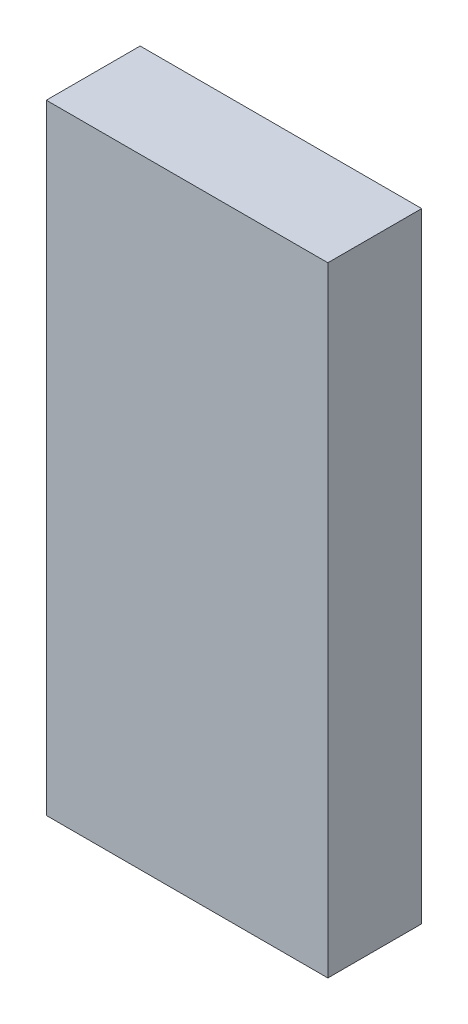
ISO-10303-21;
HEADER;
FILE_DESCRIPTION(('STEP AP214'),'2;1');
FILE_NAME('part.step','',(''),(''),'','','');
FILE_SCHEMA(('AUTOMOTIVE_DESIGN { 1 0 10303 214 1 1 1 1 }'));
ENDSEC;
DATA;
#1=APPLICATION_CONTEXT('core data for automotive mechanical design processes');
#2=APPLICATION_PROTOCOL_DEFINITION('international standard','automotive_design',2000,#1);
#3=PRODUCT_CONTEXT('',#1,'mechanical');
#4=PRODUCT('Part','Part','',(#3));
#5=PRODUCT_RELATED_PRODUCT_CATEGORY('part','',(#4));
#6=PRODUCT_DEFINITION_FORMATION('','',#4);
#7=PRODUCT_DEFINITION_CONTEXT('part definition',#1,'design');
#8=PRODUCT_DEFINITION('design','',#6,#7);
#9=PRODUCT_DEFINITION_SHAPE('','',#8);
#10=(LENGTH_UNIT() NAMED_UNIT(*) SI_UNIT(.MILLI.,.METRE.));
#11=(NAMED_UNIT(*) PLANE_ANGLE_UNIT() SI_UNIT($,.RADIAN.));
#12=(NAMED_UNIT(*) SI_UNIT($,.STERADIAN.) SOLID_ANGLE_UNIT());
#13=UNCERTAINTY_MEASURE_WITH_UNIT(LENGTH_MEASURE(1.E-05),#10,'distance_accuracy_value','');
#14=(GEOMETRIC_REPRESENTATION_CONTEXT(3) GLOBAL_UNCERTAINTY_ASSIGNED_CONTEXT((#13)) GLOBAL_UNIT_ASSIGNED_CONTEXT((#10,
#11,#12)) REPRESENTATION_CONTEXT('',''));
#15=CARTESIAN_POINT('',(0.,0.,0.));
#16=DIRECTION('',(0.,0.,1.));
#17=DIRECTION('',(1.,0.,0.));
#18=AXIS2_PLACEMENT_3D('',#15,#16,#17);
#19=CARTESIAN_POINT('',(0.,0.,5.));
#20=DIRECTION('',(1.,0.,0.));
#21=DIRECTION('',(0.,0.,-1.));
#22=AXIS2_PLACEMENT_3D('',#19,#20,#21);
#23=PLANE('',#22);
#24=DIRECTION('',(0.,-1.,0.));
#25=VECTOR('',#24,1.);
#26=CARTESIAN_POINT('',(0.,0.,0.));
#27=LINE('',#26,#25);
#28=CARTESIAN_POINT('',(0.,33.,0.));
#29=VERTEX_POINT('',#28);
#30=CARTESIAN_POINT('',(0.,0.,0.));
#31=VERTEX_POINT('',#30);
#32=EDGE_CURVE('E97',#29,#31,#27,.T.);
#33=ORIENTED_EDGE('',*,*,#32,.T.);
#34=DIRECTION('',(0.,0.,-1.));
#35=VECTOR('',#34,1.);
#36=CARTESIAN_POINT('',(0.,0.,5.));
#37=LINE('',#36,#35);
#38=CARTESIAN_POINT('',(0.,0.,5.));
#39=VERTEX_POINT('',#38);
#40=EDGE_CURVE('E11',#39,#31,#37,.T.);
#41=ORIENTED_EDGE('',*,*,#40,.F.);
#42=DIRECTION('',(0.,-1.,0.));
#43=VECTOR('',#42,1.);
#44=CARTESIAN_POINT('',(0.,0.,5.));
#45=LINE('',#44,#43);
#46=CARTESIAN_POINT('',(0.,33.,5.));
#47=VERTEX_POINT('',#46);
#48=EDGE_CURVE('E85',#47,#39,#45,.T.);
#49=ORIENTED_EDGE('',*,*,#48,.F.);
#50=DIRECTION('',(0.,0.,-1.));
#51=VECTOR('',#50,1.);
#52=CARTESIAN_POINT('',(0.,33.,5.));
#53=LINE('',#52,#51);
#54=EDGE_CURVE('E93',#47,#29,#53,.T.);
#55=ORIENTED_EDGE('',*,*,#54,.T.);
#56=EDGE_LOOP('',(#33,#41,#49,#55));
#57=FACE_BOUND('',#56,.T.);
#58=ADVANCED_FACE('F34',(#57),#23,.F.);
#59=CARTESIAN_POINT('',(0.,0.,5.));
#60=DIRECTION('',(0.,1.,0.));
#61=DIRECTION('',(0.,0.,1.));
#62=AXIS2_PLACEMENT_3D('',#59,#60,#61);
#63=PLANE('',#62);
#64=DIRECTION('',(1.,0.,0.));
#65=VECTOR('',#64,1.);
#66=CARTESIAN_POINT('',(0.,0.,0.));
#67=LINE('',#66,#65);
#68=CARTESIAN_POINT('',(15.,0.,0.));
#69=VERTEX_POINT('',#68);
#70=EDGE_CURVE('E89',#31,#69,#67,.T.);
#71=ORIENTED_EDGE('',*,*,#70,.T.);
#72=DIRECTION('',(0.,0.,-1.));
#73=VECTOR('',#72,1.);
#74=CARTESIAN_POINT('',(15.,0.,5.));
#75=LINE('',#74,#73);
#76=CARTESIAN_POINT('',(15.,0.,5.));
#77=VERTEX_POINT('',#76);
#78=EDGE_CURVE('E42',#77,#69,#75,.T.);
#79=ORIENTED_EDGE('',*,*,#78,.F.);
#80=DIRECTION('',(1.,0.,0.));
#81=VECTOR('',#80,1.);
#82=CARTESIAN_POINT('',(0.,0.,5.));
#83=LINE('',#82,#81);
#84=EDGE_CURVE('E80',#39,#77,#83,.T.);
#85=ORIENTED_EDGE('',*,*,#84,.F.);
#86=ORIENTED_EDGE('',*,*,#40,.T.);
#87=EDGE_LOOP('',(#71,#79,#85,#86));
#88=FACE_BOUND('',#87,.T.);
#89=ADVANCED_FACE('F88',(#88),#63,.F.);
#90=CARTESIAN_POINT('',(15.,0.,5.));
#91=DIRECTION('',(-1.,0.,0.));
#92=DIRECTION('',(0.,0.,1.));
#93=AXIS2_PLACEMENT_3D('',#90,#91,#92);
#94=PLANE('',#93);
#95=DIRECTION('',(0.,1.,0.));
#96=VECTOR('',#95,1.);
#97=CARTESIAN_POINT('',(15.,0.,0.));
#98=LINE('',#97,#96);
#99=CARTESIAN_POINT('',(15.,33.,0.));
#100=VERTEX_POINT('',#99);
#101=EDGE_CURVE('E67',#69,#100,#98,.T.);
#102=ORIENTED_EDGE('',*,*,#101,.T.);
#103=DIRECTION('',(0.,0.,-1.));
#104=VECTOR('',#103,1.);
#105=CARTESIAN_POINT('',(15.,33.,5.));
#106=LINE('',#105,#104);
#107=CARTESIAN_POINT('',(15.,33.,5.));
#108=VERTEX_POINT('',#107);
#109=EDGE_CURVE('E90',#108,#100,#106,.T.);
#110=ORIENTED_EDGE('',*,*,#109,.F.);
#111=DIRECTION('',(0.,1.,0.));
#112=VECTOR('',#111,1.);
#113=CARTESIAN_POINT('',(15.,0.,5.));
#114=LINE('',#113,#112);
#115=EDGE_CURVE('E83',#77,#108,#114,.T.);
#116=ORIENTED_EDGE('',*,*,#115,.F.);
#117=ORIENTED_EDGE('',*,*,#78,.T.);
#118=EDGE_LOOP('',(#102,#110,#116,#117));
#119=FACE_BOUND('',#118,.T.);
#120=ADVANCED_FACE('F91',(#119),#94,.F.);
#121=CARTESIAN_POINT('',(0.,33.,5.));
#122=DIRECTION('',(0.,-1.,0.));
#123=DIRECTION('',(0.,0.,-1.));
#124=AXIS2_PLACEMENT_3D('',#121,#122,#123);
#125=PLANE('',#124);
#126=DIRECTION('',(-1.,0.,0.));
#127=VECTOR('',#126,1.);
#128=CARTESIAN_POINT('',(0.,33.,0.));
#129=LINE('',#128,#127);
#130=EDGE_CURVE('E73',#100,#29,#129,.T.);
#131=ORIENTED_EDGE('',*,*,#130,.T.);
#132=ORIENTED_EDGE('',*,*,#54,.F.);
#133=DIRECTION('',(-1.,0.,0.));
#134=VECTOR('',#133,1.);
#135=CARTESIAN_POINT('',(0.,33.,5.));
#136=LINE('',#135,#134);
#137=EDGE_CURVE('E50',#108,#47,#136,.T.);
#138=ORIENTED_EDGE('',*,*,#137,.F.);
#139=ORIENTED_EDGE('',*,*,#109,.T.);
#140=EDGE_LOOP('',(#131,#132,#138,#139));
#141=FACE_BOUND('',#140,.T.);
#142=ADVANCED_FACE('F104',(#141),#125,.F.);
#143=CARTESIAN_POINT('',(0.,0.,5.));
#144=DIRECTION('',(0.,0.,-1.));
#145=DIRECTION('',(-1.,0.,0.));
#146=AXIS2_PLACEMENT_3D('',#143,#144,#145);
#147=PLANE('',#146);
#148=ORIENTED_EDGE('',*,*,#48,.T.);
#149=ORIENTED_EDGE('',*,*,#84,.T.);
#150=ORIENTED_EDGE('',*,*,#115,.T.);
#151=ORIENTED_EDGE('',*,*,#137,.T.);
#152=EDGE_LOOP('',(#148,#149,#150,#151));
#153=FACE_BOUND('',#152,.T.);
#154=ADVANCED_FACE('F81',(#153),#147,.F.);
#155=CARTESIAN_POINT('',(0.,0.,0.));
#156=DIRECTION('',(0.,0.,-1.));
#157=DIRECTION('',(-1.,0.,0.));
#158=AXIS2_PLACEMENT_3D('',#155,#156,#157);
#159=PLANE('',#158);
#160=ORIENTED_EDGE('',*,*,#32,.F.);
#161=ORIENTED_EDGE('',*,*,#130,.F.);
#162=ORIENTED_EDGE('',*,*,#101,.F.);
#163=ORIENTED_EDGE('',*,*,#70,.F.);
#164=EDGE_LOOP('',(#160,#161,#162,#163));
#165=FACE_BOUND('',#164,.T.);
#166=ADVANCED_FACE('F107',(#165),#159,.T.);
#167=CLOSED_SHELL('',(#58,#89,#120,#142,#154,#166));
#168=MANIFOLD_SOLID_BREP('B2',#167);
#169=ADVANCED_BREP_SHAPE_REPRESENTATION('',(#18,#168),#14);
#170=SHAPE_DEFINITION_REPRESENTATION(#9,#169);
ENDSEC;
END-ISO-10303-21;
